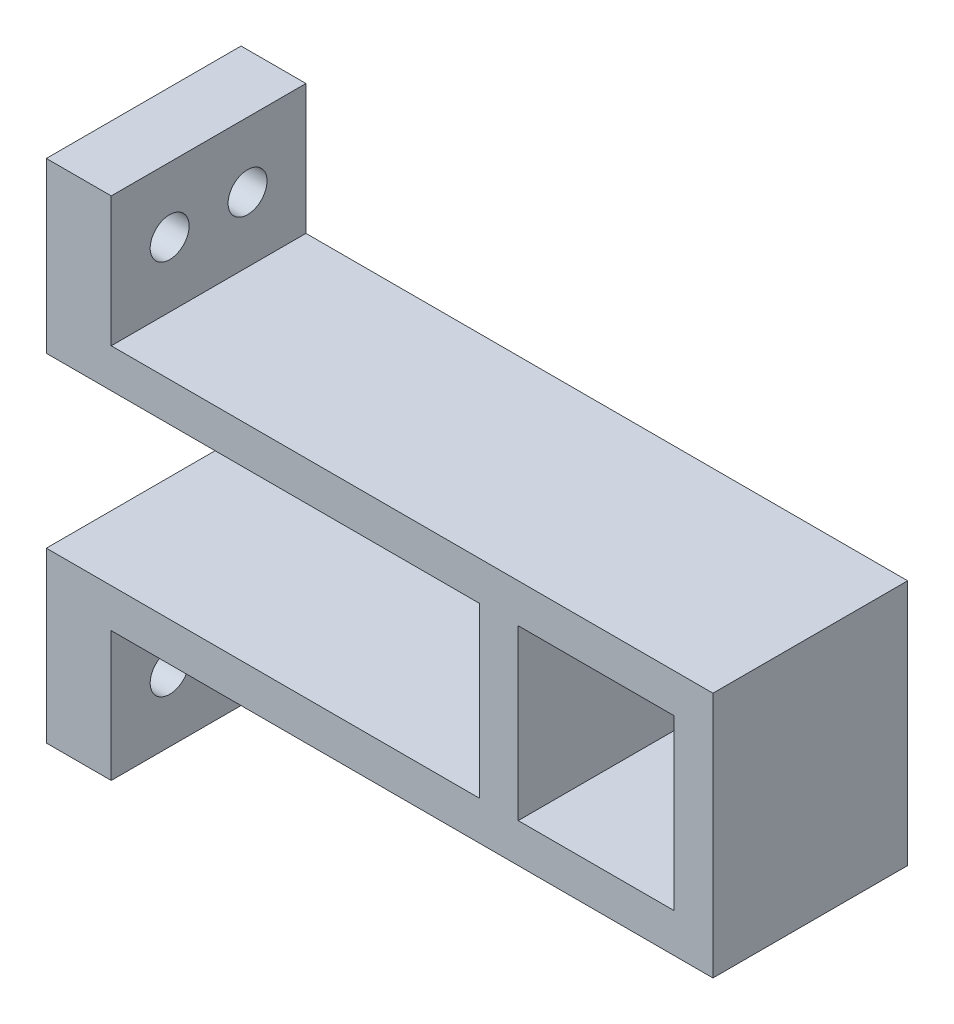
ISO-10303-21;
HEADER;
FILE_DESCRIPTION(('STEP AP214'),'2;1');
FILE_NAME('part.step','',(''),(''),'','','');
FILE_SCHEMA(('AUTOMOTIVE_DESIGN { 1 0 10303 214 1 1 1 1 }'));
ENDSEC;
DATA;
#1=APPLICATION_CONTEXT('core data for automotive mechanical design processes');
#2=APPLICATION_PROTOCOL_DEFINITION('international standard','automotive_design',2000,#1);
#3=PRODUCT_CONTEXT('',#1,'mechanical');
#4=PRODUCT('Part','Part','',(#3));
#5=PRODUCT_RELATED_PRODUCT_CATEGORY('part','',(#4));
#6=PRODUCT_DEFINITION_FORMATION('','',#4);
#7=PRODUCT_DEFINITION_CONTEXT('part definition',#1,'design');
#8=PRODUCT_DEFINITION('design','',#6,#7);
#9=PRODUCT_DEFINITION_SHAPE('','',#8);
#10=(LENGTH_UNIT() NAMED_UNIT(*) SI_UNIT(.MILLI.,.METRE.));
#11=(NAMED_UNIT(*) PLANE_ANGLE_UNIT() SI_UNIT($,.RADIAN.));
#12=(NAMED_UNIT(*) SI_UNIT($,.STERADIAN.) SOLID_ANGLE_UNIT());
#13=UNCERTAINTY_MEASURE_WITH_UNIT(LENGTH_MEASURE(1.E-05),#10,'distance_accuracy_value','');
#14=(GEOMETRIC_REPRESENTATION_CONTEXT(3) GLOBAL_UNCERTAINTY_ASSIGNED_CONTEXT((#13)) GLOBAL_UNIT_ASSIGNED_CONTEXT((#10,
#11,#12)) REPRESENTATION_CONTEXT('',''));
#15=CARTESIAN_POINT('',(0.,0.,0.));
#16=DIRECTION('',(0.,0.,1.));
#17=DIRECTION('',(1.,0.,0.));
#18=AXIS2_PLACEMENT_3D('',#15,#16,#17);
#19=CARTESIAN_POINT('',(5.,13.,0.));
#20=DIRECTION('',(0.,-1.,0.));
#21=DIRECTION('',(0.,0.,-1.));
#22=AXIS2_PLACEMENT_3D('',#19,#20,#21);
#23=PLANE('',#22);
#24=DIRECTION('',(0.,0.,1.));
#25=VECTOR('',#24,1.);
#26=CARTESIAN_POINT('',(33.35,13.,0.));
#27=LINE('',#26,#25);
#28=CARTESIAN_POINT('',(33.35,13.,-15.));
#29=VERTEX_POINT('',#28);
#30=CARTESIAN_POINT('',(33.35,13.,0.));
#31=VERTEX_POINT('',#30);
#32=EDGE_CURVE('E273',#29,#31,#27,.T.);
#33=ORIENTED_EDGE('',*,*,#32,.F.);
#34=DIRECTION('',(-1.,0.,0.));
#35=VECTOR('',#34,1.);
#36=CARTESIAN_POINT('',(5.,13.,-15.));
#37=LINE('',#36,#35);
#38=CARTESIAN_POINT('',(0.,13.,-15.));
#39=VERTEX_POINT('',#38);
#40=EDGE_CURVE('E224',#29,#39,#37,.T.);
#41=ORIENTED_EDGE('',*,*,#40,.T.);
#42=DIRECTION('',(0.,0.,1.));
#43=VECTOR('',#42,1.);
#44=CARTESIAN_POINT('',(0.,13.,0.));
#45=LINE('',#44,#43);
#46=CARTESIAN_POINT('',(0.,13.,0.));
#47=VERTEX_POINT('',#46);
#48=EDGE_CURVE('E208',#39,#47,#45,.T.);
#49=ORIENTED_EDGE('',*,*,#48,.T.);
#50=DIRECTION('',(-1.,0.,0.));
#51=VECTOR('',#50,1.);
#52=CARTESIAN_POINT('',(5.,13.,0.));
#53=LINE('',#52,#51);
#54=EDGE_CURVE('E213',#31,#47,#53,.T.);
#55=ORIENTED_EDGE('',*,*,#54,.F.);
#56=EDGE_LOOP('',(#33,#41,#49,#55));
#57=FACE_BOUND('',#56,.T.);
#58=ADVANCED_FACE('F32',(#57),#23,.F.);
#59=CARTESIAN_POINT('',(5.,26.,0.));
#60=DIRECTION('',(0.,1.,0.));
#61=DIRECTION('',(0.,0.,1.));
#62=AXIS2_PLACEMENT_3D('',#59,#60,#61);
#63=PLANE('',#62);
#64=DIRECTION('',(0.,0.,-1.));
#65=VECTOR('',#64,1.);
#66=CARTESIAN_POINT('',(33.35,26.,0.));
#67=LINE('',#66,#65);
#68=CARTESIAN_POINT('',(33.35,26.,0.));
#69=VERTEX_POINT('',#68);
#70=CARTESIAN_POINT('',(33.35,26.,-15.));
#71=VERTEX_POINT('',#70);
#72=EDGE_CURVE('E11',#69,#71,#67,.T.);
#73=ORIENTED_EDGE('',*,*,#72,.F.);
#74=DIRECTION('',(-1.,0.,0.));
#75=VECTOR('',#74,1.);
#76=CARTESIAN_POINT('',(5.,26.,0.));
#77=LINE('',#76,#75);
#78=CARTESIAN_POINT('',(0.,26.,0.));
#79=VERTEX_POINT('',#78);
#80=EDGE_CURVE('E158',#69,#79,#77,.T.);
#81=ORIENTED_EDGE('',*,*,#80,.T.);
#82=DIRECTION('',(0.,0.,-1.));
#83=VECTOR('',#82,1.);
#84=CARTESIAN_POINT('',(0.,26.,0.));
#85=LINE('',#84,#83);
#86=CARTESIAN_POINT('',(0.,26.,-15.));
#87=VERTEX_POINT('',#86);
#88=EDGE_CURVE('E302',#79,#87,#85,.T.);
#89=ORIENTED_EDGE('',*,*,#88,.T.);
#90=DIRECTION('',(-1.,0.,0.));
#91=VECTOR('',#90,1.);
#92=CARTESIAN_POINT('',(5.,26.,-15.));
#93=LINE('',#92,#91);
#94=EDGE_CURVE('E311',#71,#87,#93,.T.);
#95=ORIENTED_EDGE('',*,*,#94,.F.);
#96=EDGE_LOOP('',(#73,#81,#89,#95));
#97=FACE_BOUND('',#96,.T.);
#98=ADVANCED_FACE('F337',(#97),#63,.F.);
#99=CARTESIAN_POINT('',(48.35,0.,0.));
#100=DIRECTION('',(1.,0.,0.));
#101=DIRECTION('',(0.,0.,-1.));
#102=AXIS2_PLACEMENT_3D('',#99,#100,#101);
#103=PLANE('',#102);
#104=DIRECTION('',(0.,0.,-1.));
#105=VECTOR('',#104,1.);
#106=CARTESIAN_POINT('',(48.35,26.,0.));
#107=LINE('',#106,#105);
#108=CARTESIAN_POINT('',(48.35,26.,0.));
#109=VERTEX_POINT('',#108);
#110=CARTESIAN_POINT('',(48.35,26.,-15.));
#111=VERTEX_POINT('',#110);
#112=EDGE_CURVE('E155',#109,#111,#107,.T.);
#113=ORIENTED_EDGE('',*,*,#112,.T.);
#114=DIRECTION('',(0.,1.,0.));
#115=VECTOR('',#114,1.);
#116=CARTESIAN_POINT('',(48.35,29.,-15.));
#117=LINE('',#116,#115);
#118=CARTESIAN_POINT('',(48.35,13.,-15.));
#119=VERTEX_POINT('',#118);
#120=EDGE_CURVE('E160',#119,#111,#117,.T.);
#121=ORIENTED_EDGE('',*,*,#120,.F.);
#122=DIRECTION('',(0.,0.,1.));
#123=VECTOR('',#122,1.);
#124=CARTESIAN_POINT('',(48.35,13.,0.));
#125=LINE('',#124,#123);
#126=CARTESIAN_POINT('',(48.35,13.,0.));
#127=VERTEX_POINT('',#126);
#128=EDGE_CURVE('E183',#119,#127,#125,.T.);
#129=ORIENTED_EDGE('',*,*,#128,.T.);
#130=DIRECTION('',(0.,-1.,0.));
#131=VECTOR('',#130,1.);
#132=CARTESIAN_POINT('',(48.35,29.,0.));
#133=LINE('',#132,#131);
#134=EDGE_CURVE('E157',#109,#127,#133,.T.);
#135=ORIENTED_EDGE('',*,*,#134,.F.);
#136=EDGE_LOOP('',(#113,#121,#129,#135));
#137=FACE_BOUND('',#136,.T.);
#138=ADVANCED_FACE('F320',(#137),#103,.F.);
#139=CARTESIAN_POINT('',(5.,0.,0.));
#140=DIRECTION('',(-1.,0.,0.));
#141=DIRECTION('',(0.,0.,1.));
#142=AXIS2_PLACEMENT_3D('',#139,#140,#141);
#143=PLANE('',#142);
#144=CARTESIAN_POINT('',(5.,5.,-10.5));
#145=DIRECTION('',(1.,0.,0.));
#146=DIRECTION('',(0.,0.,-1.));
#147=AXIS2_PLACEMENT_3D('',#144,#145,#146);
#148=CIRCLE('',#147,1.5);
#149=CARTESIAN_POINT('',(5.,5.,-12.));
#150=VERTEX_POINT('',#149);
#151=EDGE_CURVE('E193',#150,#150,#148,.T.);
#152=ORIENTED_EDGE('',*,*,#151,.F.);
#153=EDGE_LOOP('',(#152));
#154=FACE_BOUND('',#153,.T.);
#155=CARTESIAN_POINT('',(5.,5.,-4.5));
#156=DIRECTION('',(1.,0.,0.));
#157=DIRECTION('',(0.,0.,-1.));
#158=AXIS2_PLACEMENT_3D('',#155,#156,#157);
#159=CIRCLE('',#158,1.5);
#160=CARTESIAN_POINT('',(5.,5.,-6.));
#161=VERTEX_POINT('',#160);
#162=EDGE_CURVE('E199',#161,#161,#159,.T.);
#163=ORIENTED_EDGE('',*,*,#162,.F.);
#164=EDGE_LOOP('',(#163));
#165=FACE_BOUND('',#164,.T.);
#166=DIRECTION('',(0.,0.,-1.));
#167=VECTOR('',#166,1.);
#168=CARTESIAN_POINT('',(5.,10.,0.));
#169=LINE('',#168,#167);
#170=CARTESIAN_POINT('',(5.,9.99999999999999,0.));
#171=VERTEX_POINT('',#170);
#172=CARTESIAN_POINT('',(5.,10.,-15.));
#173=VERTEX_POINT('',#172);
#174=EDGE_CURVE('E182',#171,#173,#169,.T.);
#175=ORIENTED_EDGE('',*,*,#174,.F.);
#176=DIRECTION('',(0.,-1.,0.));
#177=VECTOR('',#176,1.);
#178=CARTESIAN_POINT('',(5.,0.,0.));
#179=LINE('',#178,#177);
#180=CARTESIAN_POINT('',(5.,0.,0.));
#181=VERTEX_POINT('',#180);
#182=EDGE_CURVE('E205',#171,#181,#179,.T.);
#183=ORIENTED_EDGE('',*,*,#182,.T.);
#184=DIRECTION('',(0.,0.,-1.));
#185=VECTOR('',#184,1.);
#186=CARTESIAN_POINT('',(5.,0.,0.));
#187=LINE('',#186,#185);
#188=CARTESIAN_POINT('',(5.,0.,-15.));
#189=VERTEX_POINT('',#188);
#190=EDGE_CURVE('E207',#181,#189,#187,.T.);
#191=ORIENTED_EDGE('',*,*,#190,.T.);
#192=DIRECTION('',(0.,1.,0.));
#193=VECTOR('',#192,1.);
#194=CARTESIAN_POINT('',(5.,0.,-15.));
#195=LINE('',#194,#193);
#196=EDGE_CURVE('E210',#189,#173,#195,.T.);
#197=ORIENTED_EDGE('',*,*,#196,.T.);
#198=EDGE_LOOP('',(#175,#183,#191,#197));
#199=FACE_BOUND('',#198,.T.);
#200=ADVANCED_FACE('F254',(#154,#165,#199),#143,.F.);
#201=CARTESIAN_POINT('',(0.,0.,0.));
#202=DIRECTION('',(-1.,0.,0.));
#203=DIRECTION('',(0.,0.,1.));
#204=AXIS2_PLACEMENT_3D('',#201,#202,#203);
#205=PLANE('',#204);
#206=CARTESIAN_POINT('',(0.,5.,-4.5));
#207=DIRECTION('',(1.,0.,0.));
#208=DIRECTION('',(0.,0.,-1.));
#209=AXIS2_PLACEMENT_3D('',#206,#207,#208);
#210=CIRCLE('',#209,1.5);
#211=CARTESIAN_POINT('',(0.,5.,-6.));
#212=VERTEX_POINT('',#211);
#213=EDGE_CURVE('E196',#212,#212,#210,.T.);
#214=ORIENTED_EDGE('',*,*,#213,.T.);
#215=EDGE_LOOP('',(#214));
#216=FACE_BOUND('',#215,.T.);
#217=DIRECTION('',(0.,-1.,0.));
#218=VECTOR('',#217,1.);
#219=CARTESIAN_POINT('',(0.,0.,0.));
#220=LINE('',#219,#218);
#221=CARTESIAN_POINT('',(0.,0.,0.));
#222=VERTEX_POINT('',#221);
#223=EDGE_CURVE('E202',#47,#222,#220,.T.);
#224=ORIENTED_EDGE('',*,*,#223,.F.);
#225=ORIENTED_EDGE('',*,*,#48,.F.);
#226=DIRECTION('',(0.,1.,0.));
#227=VECTOR('',#226,1.);
#228=CARTESIAN_POINT('',(0.,0.,-15.));
#229=LINE('',#228,#227);
#230=CARTESIAN_POINT('',(0.,0.,-15.));
#231=VERTEX_POINT('',#230);
#232=EDGE_CURVE('E218',#231,#39,#229,.T.);
#233=ORIENTED_EDGE('',*,*,#232,.F.);
#234=DIRECTION('',(0.,0.,-1.));
#235=VECTOR('',#234,1.);
#236=CARTESIAN_POINT('',(0.,0.,0.));
#237=LINE('',#236,#235);
#238=EDGE_CURVE('E216',#222,#231,#237,.T.);
#239=ORIENTED_EDGE('',*,*,#238,.F.);
#240=EDGE_LOOP('',(#224,#225,#233,#239));
#241=FACE_BOUND('',#240,.T.);
#242=CARTESIAN_POINT('',(0.,5.,-10.5));
#243=DIRECTION('',(1.,0.,0.));
#244=DIRECTION('',(0.,0.,-1.));
#245=AXIS2_PLACEMENT_3D('',#242,#243,#244);
#246=CIRCLE('',#245,1.5);
#247=CARTESIAN_POINT('',(0.,5.,-12.));
#248=VERTEX_POINT('',#247);
#249=EDGE_CURVE('E192',#248,#248,#246,.T.);
#250=ORIENTED_EDGE('',*,*,#249,.T.);
#251=EDGE_LOOP('',(#250));
#252=FACE_BOUND('',#251,.T.);
#253=ADVANCED_FACE('F243',(#216,#241,#252),#205,.T.);
#254=CARTESIAN_POINT('',(5.,0.,0.));
#255=DIRECTION('',(0.,0.,-1.));
#256=DIRECTION('',(-1.,0.,0.));
#257=AXIS2_PLACEMENT_3D('',#254,#255,#256);
#258=PLANE('',#257);
#259=DIRECTION('',(0.,-1.,0.));
#260=VECTOR('',#259,1.);
#261=CARTESIAN_POINT('',(36.35,29.,0.));
#262=LINE('',#261,#260);
#263=CARTESIAN_POINT('',(36.35,26.,0.));
#264=VERTEX_POINT('',#263);
#265=CARTESIAN_POINT('',(36.35,13.,0.));
#266=VERTEX_POINT('',#265);
#267=EDGE_CURVE('E47',#264,#266,#262,.T.);
#268=ORIENTED_EDGE('',*,*,#267,.F.);
#269=EDGE_CURVE('E148',#109,#264,#77,.T.);
#270=ORIENTED_EDGE('',*,*,#269,.F.);
#271=ORIENTED_EDGE('',*,*,#134,.T.);
#272=EDGE_CURVE('E151',#127,#266,#53,.T.);
#273=ORIENTED_EDGE('',*,*,#272,.T.);
#274=EDGE_LOOP('',(#268,#270,#271,#273));
#275=FACE_BOUND('',#274,.T.);
#276=DIRECTION('',(-1.,0.,0.));
#277=VECTOR('',#276,1.);
#278=CARTESIAN_POINT('',(51.35,29.,0.));
#279=LINE('',#278,#277);
#280=CARTESIAN_POINT('',(51.35,29.,0.));
#281=VERTEX_POINT('',#280);
#282=CARTESIAN_POINT('',(5.,29.,0.));
#283=VERTEX_POINT('',#282);
#284=EDGE_CURVE('E175',#281,#283,#279,.T.);
#285=ORIENTED_EDGE('',*,*,#284,.T.);
#286=DIRECTION('',(0.,-1.,0.));
#287=VECTOR('',#286,1.);
#288=CARTESIAN_POINT('',(5.,26.,0.));
#289=LINE('',#288,#287);
#290=CARTESIAN_POINT('',(5.,39.,0.));
#291=VERTEX_POINT('',#290);
#292=EDGE_CURVE('E292',#291,#283,#289,.T.);
#293=ORIENTED_EDGE('',*,*,#292,.F.);
#294=DIRECTION('',(-1.,0.,0.));
#295=VECTOR('',#294,1.);
#296=CARTESIAN_POINT('',(5.,39.,0.));
#297=LINE('',#296,#295);
#298=CARTESIAN_POINT('',(0.,39.,0.));
#299=VERTEX_POINT('',#298);
#300=EDGE_CURVE('E299',#291,#299,#297,.T.);
#301=ORIENTED_EDGE('',*,*,#300,.T.);
#302=DIRECTION('',(0.,-1.,0.));
#303=VECTOR('',#302,1.);
#304=CARTESIAN_POINT('',(0.,26.,0.));
#305=LINE('',#304,#303);
#306=EDGE_CURVE('E289',#299,#79,#305,.T.);
#307=ORIENTED_EDGE('',*,*,#306,.T.);
#308=ORIENTED_EDGE('',*,*,#80,.F.);
#309=DIRECTION('',(0.,-1.,0.));
#310=VECTOR('',#309,1.);
#311=CARTESIAN_POINT('',(33.35,29.,0.));
#312=LINE('',#311,#310);
#313=EDGE_CURVE('E326',#69,#31,#312,.T.);
#314=ORIENTED_EDGE('',*,*,#313,.T.);
#315=ORIENTED_EDGE('',*,*,#54,.T.);
#316=ORIENTED_EDGE('',*,*,#223,.T.);
#317=DIRECTION('',(-1.,0.,0.));
#318=VECTOR('',#317,1.);
#319=CARTESIAN_POINT('',(5.,0.,0.));
#320=LINE('',#319,#318);
#321=EDGE_CURVE('E144',#181,#222,#320,.T.);
#322=ORIENTED_EDGE('',*,*,#321,.F.);
#323=ORIENTED_EDGE('',*,*,#182,.F.);
#324=DIRECTION('',(-1.,0.,0.));
#325=VECTOR('',#324,1.);
#326=CARTESIAN_POINT('',(48.35,10.,0.));
#327=LINE('',#326,#325);
#328=CARTESIAN_POINT('',(51.35,10.,0.));
#329=VERTEX_POINT('',#328);
#330=EDGE_CURVE('E190',#329,#171,#327,.T.);
#331=ORIENTED_EDGE('',*,*,#330,.F.);
#332=DIRECTION('',(0.,-1.,0.));
#333=VECTOR('',#332,1.);
#334=CARTESIAN_POINT('',(51.35,29.,0.));
#335=LINE('',#334,#333);
#336=EDGE_CURVE('E166',#281,#329,#335,.T.);
#337=ORIENTED_EDGE('',*,*,#336,.F.);
#338=EDGE_LOOP('',(#285,#293,#301,#307,#308,#314,#315,#316,#322,#323,#331,#337));
#339=FACE_BOUND('',#338,.T.);
#340=ADVANCED_FACE('F34',(#275,#339),#258,.F.);
#341=CARTESIAN_POINT('',(5.,0.,0.));
#342=DIRECTION('',(0.,1.,0.));
#343=DIRECTION('',(0.,0.,1.));
#344=AXIS2_PLACEMENT_3D('',#341,#342,#343);
#345=PLANE('',#344);
#346=ORIENTED_EDGE('',*,*,#238,.T.);
#347=DIRECTION('',(-1.,0.,0.));
#348=VECTOR('',#347,1.);
#349=CARTESIAN_POINT('',(5.,0.,-15.));
#350=LINE('',#349,#348);
#351=EDGE_CURVE('E228',#189,#231,#350,.T.);
#352=ORIENTED_EDGE('',*,*,#351,.F.);
#353=ORIENTED_EDGE('',*,*,#190,.F.);
#354=ORIENTED_EDGE('',*,*,#321,.T.);
#355=EDGE_LOOP('',(#346,#352,#353,#354));
#356=FACE_BOUND('',#355,.T.);
#357=ADVANCED_FACE('F235',(#356),#345,.F.);
#358=CARTESIAN_POINT('',(5.,0.,-15.));
#359=DIRECTION('',(0.,0.,1.));
#360=DIRECTION('',(1.,0.,0.));
#361=AXIS2_PLACEMENT_3D('',#358,#359,#360);
#362=PLANE('',#361);
#363=DIRECTION('',(0.,1.,0.));
#364=VECTOR('',#363,1.);
#365=CARTESIAN_POINT('',(36.35,29.,-15.));
#366=LINE('',#365,#364);
#367=CARTESIAN_POINT('',(36.35,13.,-15.));
#368=VERTEX_POINT('',#367);
#369=CARTESIAN_POINT('',(36.35,26.,-15.));
#370=VERTEX_POINT('',#369);
#371=EDGE_CURVE('E52',#368,#370,#366,.T.);
#372=ORIENTED_EDGE('',*,*,#371,.F.);
#373=EDGE_CURVE('E225',#119,#368,#37,.T.);
#374=ORIENTED_EDGE('',*,*,#373,.F.);
#375=ORIENTED_EDGE('',*,*,#120,.T.);
#376=EDGE_CURVE('E162',#111,#370,#93,.T.);
#377=ORIENTED_EDGE('',*,*,#376,.T.);
#378=EDGE_LOOP('',(#372,#374,#375,#377));
#379=FACE_BOUND('',#378,.T.);
#380=DIRECTION('',(-1.,0.,0.));
#381=VECTOR('',#380,1.);
#382=CARTESIAN_POINT('',(48.35,10.,-15.));
#383=LINE('',#382,#381);
#384=CARTESIAN_POINT('',(51.35,10.,-15.));
#385=VERTEX_POINT('',#384);
#386=EDGE_CURVE('E186',#385,#173,#383,.T.);
#387=ORIENTED_EDGE('',*,*,#386,.T.);
#388=ORIENTED_EDGE('',*,*,#196,.F.);
#389=ORIENTED_EDGE('',*,*,#351,.T.);
#390=ORIENTED_EDGE('',*,*,#232,.T.);
#391=ORIENTED_EDGE('',*,*,#40,.F.);
#392=DIRECTION('',(0.,1.,0.));
#393=VECTOR('',#392,1.);
#394=CARTESIAN_POINT('',(33.35,29.,-15.));
#395=LINE('',#394,#393);
#396=EDGE_CURVE('E324',#29,#71,#395,.T.);
#397=ORIENTED_EDGE('',*,*,#396,.T.);
#398=ORIENTED_EDGE('',*,*,#94,.T.);
#399=DIRECTION('',(0.,1.,0.));
#400=VECTOR('',#399,1.);
#401=CARTESIAN_POINT('',(0.,26.,-15.));
#402=LINE('',#401,#400);
#403=CARTESIAN_POINT('',(0.,39.,-15.));
#404=VERTEX_POINT('',#403);
#405=EDGE_CURVE('E305',#87,#404,#402,.T.);
#406=ORIENTED_EDGE('',*,*,#405,.T.);
#407=DIRECTION('',(-1.,0.,0.));
#408=VECTOR('',#407,1.);
#409=CARTESIAN_POINT('',(5.,39.,-15.));
#410=LINE('',#409,#408);
#411=CARTESIAN_POINT('',(5.,39.,-15.));
#412=VERTEX_POINT('',#411);
#413=EDGE_CURVE('E309',#412,#404,#410,.T.);
#414=ORIENTED_EDGE('',*,*,#413,.F.);
#415=DIRECTION('',(0.,1.,0.));
#416=VECTOR('',#415,1.);
#417=CARTESIAN_POINT('',(5.,26.,-15.));
#418=LINE('',#417,#416);
#419=CARTESIAN_POINT('',(5.,29.,-15.));
#420=VERTEX_POINT('',#419);
#421=EDGE_CURVE('E294',#420,#412,#418,.T.);
#422=ORIENTED_EDGE('',*,*,#421,.F.);
#423=DIRECTION('',(-1.,0.,0.));
#424=VECTOR('',#423,1.);
#425=CARTESIAN_POINT('',(51.35,29.,-15.));
#426=LINE('',#425,#424);
#427=CARTESIAN_POINT('',(51.35,29.,-15.));
#428=VERTEX_POINT('',#427);
#429=EDGE_CURVE('E180',#428,#420,#426,.T.);
#430=ORIENTED_EDGE('',*,*,#429,.F.);
#431=DIRECTION('',(0.,1.,0.));
#432=VECTOR('',#431,1.);
#433=CARTESIAN_POINT('',(51.35,29.,-15.));
#434=LINE('',#433,#432);
#435=EDGE_CURVE('E172',#385,#428,#434,.T.);
#436=ORIENTED_EDGE('',*,*,#435,.F.);
#437=EDGE_LOOP('',(#387,#388,#389,#390,#391,#397,#398,#406,#414,#422,#430,#436));
#438=FACE_BOUND('',#437,.T.);
#439=ADVANCED_FACE('F248',(#379,#438),#362,.F.);
#440=ORIENTED_EDGE('',*,*,#373,.T.);
#441=DIRECTION('',(0.,0.,1.));
#442=VECTOR('',#441,1.);
#443=CARTESIAN_POINT('',(36.35,13.,0.));
#444=LINE('',#443,#442);
#445=EDGE_CURVE('E277',#368,#266,#444,.T.);
#446=ORIENTED_EDGE('',*,*,#445,.T.);
#447=ORIENTED_EDGE('',*,*,#272,.F.);
#448=ORIENTED_EDGE('',*,*,#128,.F.);
#449=EDGE_LOOP('',(#440,#446,#447,#448));
#450=FACE_BOUND('',#449,.T.);
#451=ADVANCED_FACE('F323',(#450),#23,.F.);
#452=CARTESIAN_POINT('',(5.,5.,-4.5));
#453=DIRECTION('',(-1.,0.,0.));
#454=DIRECTION('',(0.,0.,1.));
#455=AXIS2_PLACEMENT_3D('',#452,#453,#454);
#456=CYLINDRICAL_SURFACE('',#455,1.5);
#457=ORIENTED_EDGE('',*,*,#162,.T.);
#458=EDGE_LOOP('',(#457));
#459=FACE_BOUND('',#458,.T.);
#460=ORIENTED_EDGE('',*,*,#213,.F.);
#461=EDGE_LOOP('',(#460));
#462=FACE_BOUND('',#461,.T.);
#463=ADVANCED_FACE('F369',(#459,#462),#456,.F.);
#464=CARTESIAN_POINT('',(5.,5.,-10.5));
#465=DIRECTION('',(-1.,0.,0.));
#466=DIRECTION('',(0.,0.,1.));
#467=AXIS2_PLACEMENT_3D('',#464,#465,#466);
#468=CYLINDRICAL_SURFACE('',#467,1.5);
#469=ORIENTED_EDGE('',*,*,#151,.T.);
#470=EDGE_LOOP('',(#469));
#471=FACE_BOUND('',#470,.T.);
#472=ORIENTED_EDGE('',*,*,#249,.F.);
#473=EDGE_LOOP('',(#472));
#474=FACE_BOUND('',#473,.T.);
#475=ADVANCED_FACE('F374',(#471,#474),#468,.F.);
#476=CARTESIAN_POINT('',(48.35,10.,0.));
#477=DIRECTION('',(0.,1.,0.));
#478=DIRECTION('',(0.,0.,1.));
#479=AXIS2_PLACEMENT_3D('',#476,#477,#478);
#480=PLANE('',#479);
#481=ORIENTED_EDGE('',*,*,#330,.T.);
#482=ORIENTED_EDGE('',*,*,#174,.T.);
#483=ORIENTED_EDGE('',*,*,#386,.F.);
#484=DIRECTION('',(0.,0.,-1.));
#485=VECTOR('',#484,1.);
#486=CARTESIAN_POINT('',(51.35,10.,0.));
#487=LINE('',#486,#485);
#488=EDGE_CURVE('E169',#329,#385,#487,.T.);
#489=ORIENTED_EDGE('',*,*,#488,.F.);
#490=EDGE_LOOP('',(#481,#482,#483,#489));
#491=FACE_BOUND('',#490,.T.);
#492=ADVANCED_FACE('F256',(#491),#480,.F.);
#493=CARTESIAN_POINT('',(51.35,29.,0.));
#494=DIRECTION('',(0.,-1.,0.));
#495=DIRECTION('',(0.,0.,-1.));
#496=AXIS2_PLACEMENT_3D('',#493,#494,#495);
#497=PLANE('',#496);
#498=ORIENTED_EDGE('',*,*,#429,.T.);
#499=DIRECTION('',(0.,0.,1.));
#500=VECTOR('',#499,1.);
#501=CARTESIAN_POINT('',(5.,29.,0.));
#502=LINE('',#501,#500);
#503=EDGE_CURVE('E270',#420,#283,#502,.T.);
#504=ORIENTED_EDGE('',*,*,#503,.T.);
#505=ORIENTED_EDGE('',*,*,#284,.F.);
#506=DIRECTION('',(0.,0.,1.));
#507=VECTOR('',#506,1.);
#508=CARTESIAN_POINT('',(51.35,29.,0.));
#509=LINE('',#508,#507);
#510=EDGE_CURVE('E174',#428,#281,#509,.T.);
#511=ORIENTED_EDGE('',*,*,#510,.F.);
#512=EDGE_LOOP('',(#498,#504,#505,#511));
#513=FACE_BOUND('',#512,.T.);
#514=ADVANCED_FACE('F268',(#513),#497,.F.);
#515=CARTESIAN_POINT('',(51.35,0.,0.));
#516=DIRECTION('',(1.,0.,0.));
#517=DIRECTION('',(0.,0.,-1.));
#518=AXIS2_PLACEMENT_3D('',#515,#516,#517);
#519=PLANE('',#518);
#520=ORIENTED_EDGE('',*,*,#336,.T.);
#521=ORIENTED_EDGE('',*,*,#488,.T.);
#522=ORIENTED_EDGE('',*,*,#435,.T.);
#523=ORIENTED_EDGE('',*,*,#510,.T.);
#524=EDGE_LOOP('',(#520,#521,#522,#523));
#525=FACE_BOUND('',#524,.T.);
#526=ADVANCED_FACE('F263',(#525),#519,.T.);
#527=CARTESIAN_POINT('',(5.,0.,0.));
#528=DIRECTION('',(-1.,0.,0.));
#529=DIRECTION('',(0.,0.,1.));
#530=AXIS2_PLACEMENT_3D('',#527,#528,#529);
#531=PLANE('',#530);
#532=CARTESIAN_POINT('',(5.,34.,-10.5));
#533=DIRECTION('',(1.,0.,0.));
#534=DIRECTION('',(0.,0.,-1.));
#535=AXIS2_PLACEMENT_3D('',#532,#533,#534);
#536=CIRCLE('',#535,1.5);
#537=CARTESIAN_POINT('',(5.,34.,-12.));
#538=VERTEX_POINT('',#537);
#539=EDGE_CURVE('E280',#538,#538,#536,.T.);
#540=ORIENTED_EDGE('',*,*,#539,.F.);
#541=EDGE_LOOP('',(#540));
#542=FACE_BOUND('',#541,.T.);
#543=CARTESIAN_POINT('',(5.,34.,-4.5));
#544=DIRECTION('',(1.,0.,0.));
#545=DIRECTION('',(0.,0.,-1.));
#546=AXIS2_PLACEMENT_3D('',#543,#544,#545);
#547=CIRCLE('',#546,1.5);
#548=CARTESIAN_POINT('',(5.,34.,-6.));
#549=VERTEX_POINT('',#548);
#550=EDGE_CURVE('E286',#549,#549,#547,.T.);
#551=ORIENTED_EDGE('',*,*,#550,.F.);
#552=EDGE_LOOP('',(#551));
#553=FACE_BOUND('',#552,.T.);
#554=ORIENTED_EDGE('',*,*,#503,.F.);
#555=ORIENTED_EDGE('',*,*,#421,.T.);
#556=DIRECTION('',(0.,0.,1.));
#557=VECTOR('',#556,1.);
#558=CARTESIAN_POINT('',(5.,39.,0.));
#559=LINE('',#558,#557);
#560=EDGE_CURVE('E297',#412,#291,#559,.T.);
#561=ORIENTED_EDGE('',*,*,#560,.T.);
#562=ORIENTED_EDGE('',*,*,#292,.T.);
#563=EDGE_LOOP('',(#554,#555,#561,#562));
#564=FACE_BOUND('',#563,.T.);
#565=ADVANCED_FACE('F346',(#542,#553,#564),#531,.F.);
#566=CARTESIAN_POINT('',(0.,0.,0.));
#567=DIRECTION('',(-1.,0.,0.));
#568=DIRECTION('',(0.,0.,1.));
#569=AXIS2_PLACEMENT_3D('',#566,#567,#568);
#570=PLANE('',#569);
#571=CARTESIAN_POINT('',(0.,34.,-4.5));
#572=DIRECTION('',(1.,0.,0.));
#573=DIRECTION('',(0.,0.,-1.));
#574=AXIS2_PLACEMENT_3D('',#571,#572,#573);
#575=CIRCLE('',#574,1.5);
#576=CARTESIAN_POINT('',(0.,34.,-6.));
#577=VERTEX_POINT('',#576);
#578=EDGE_CURVE('E283',#577,#577,#575,.T.);
#579=ORIENTED_EDGE('',*,*,#578,.T.);
#580=EDGE_LOOP('',(#579));
#581=FACE_BOUND('',#580,.T.);
#582=ORIENTED_EDGE('',*,*,#306,.F.);
#583=DIRECTION('',(0.,0.,1.));
#584=VECTOR('',#583,1.);
#585=CARTESIAN_POINT('',(0.,39.,0.));
#586=LINE('',#585,#584);
#587=EDGE_CURVE('E295',#404,#299,#586,.T.);
#588=ORIENTED_EDGE('',*,*,#587,.F.);
#589=ORIENTED_EDGE('',*,*,#405,.F.);
#590=ORIENTED_EDGE('',*,*,#88,.F.);
#591=EDGE_LOOP('',(#582,#588,#589,#590));
#592=FACE_BOUND('',#591,.T.);
#593=CARTESIAN_POINT('',(0.,34.,-10.5));
#594=DIRECTION('',(1.,0.,0.));
#595=DIRECTION('',(0.,0.,-1.));
#596=AXIS2_PLACEMENT_3D('',#593,#594,#595);
#597=CIRCLE('',#596,1.5);
#598=CARTESIAN_POINT('',(0.,34.,-12.));
#599=VERTEX_POINT('',#598);
#600=EDGE_CURVE('E275',#599,#599,#597,.T.);
#601=ORIENTED_EDGE('',*,*,#600,.T.);
#602=EDGE_LOOP('',(#601));
#603=FACE_BOUND('',#602,.T.);
#604=ADVANCED_FACE('F342',(#581,#592,#603),#570,.T.);
#605=ORIENTED_EDGE('',*,*,#269,.T.);
#606=DIRECTION('',(0.,0.,-1.));
#607=VECTOR('',#606,1.);
#608=CARTESIAN_POINT('',(36.35,26.,0.));
#609=LINE('',#608,#607);
#610=EDGE_CURVE('E40',#264,#370,#609,.T.);
#611=ORIENTED_EDGE('',*,*,#610,.T.);
#612=ORIENTED_EDGE('',*,*,#376,.F.);
#613=ORIENTED_EDGE('',*,*,#112,.F.);
#614=EDGE_LOOP('',(#605,#611,#612,#613));
#615=FACE_BOUND('',#614,.T.);
#616=ADVANCED_FACE('F153',(#615),#63,.F.);
#617=CARTESIAN_POINT('',(5.,39.,0.));
#618=DIRECTION('',(0.,-1.,0.));
#619=DIRECTION('',(0.,0.,-1.));
#620=AXIS2_PLACEMENT_3D('',#617,#618,#619);
#621=PLANE('',#620);
#622=ORIENTED_EDGE('',*,*,#587,.T.);
#623=ORIENTED_EDGE('',*,*,#300,.F.);
#624=ORIENTED_EDGE('',*,*,#560,.F.);
#625=ORIENTED_EDGE('',*,*,#413,.T.);
#626=EDGE_LOOP('',(#622,#623,#624,#625));
#627=FACE_BOUND('',#626,.T.);
#628=ADVANCED_FACE('F345',(#627),#621,.F.);
#629=CARTESIAN_POINT('',(5.,34.,-4.5));
#630=DIRECTION('',(-1.,0.,0.));
#631=DIRECTION('',(0.,0.,1.));
#632=AXIS2_PLACEMENT_3D('',#629,#630,#631);
#633=CYLINDRICAL_SURFACE('',#632,1.5);
#634=ORIENTED_EDGE('',*,*,#550,.T.);
#635=EDGE_LOOP('',(#634));
#636=FACE_BOUND('',#635,.T.);
#637=ORIENTED_EDGE('',*,*,#578,.F.);
#638=EDGE_LOOP('',(#637));
#639=FACE_BOUND('',#638,.T.);
#640=ADVANCED_FACE('F404',(#636,#639),#633,.F.);
#641=CARTESIAN_POINT('',(5.,34.,-10.5));
#642=DIRECTION('',(-1.,0.,0.));
#643=DIRECTION('',(0.,0.,1.));
#644=AXIS2_PLACEMENT_3D('',#641,#642,#643);
#645=CYLINDRICAL_SURFACE('',#644,1.5);
#646=ORIENTED_EDGE('',*,*,#539,.T.);
#647=EDGE_LOOP('',(#646));
#648=FACE_BOUND('',#647,.T.);
#649=ORIENTED_EDGE('',*,*,#600,.F.);
#650=EDGE_LOOP('',(#649));
#651=FACE_BOUND('',#650,.T.);
#652=ADVANCED_FACE('F408',(#648,#651),#645,.F.);
#653=CARTESIAN_POINT('',(33.35,0.,0.));
#654=DIRECTION('',(1.,0.,0.));
#655=DIRECTION('',(0.,0.,-1.));
#656=AXIS2_PLACEMENT_3D('',#653,#654,#655);
#657=PLANE('',#656);
#658=ORIENTED_EDGE('',*,*,#396,.F.);
#659=ORIENTED_EDGE('',*,*,#32,.T.);
#660=ORIENTED_EDGE('',*,*,#313,.F.);
#661=ORIENTED_EDGE('',*,*,#72,.T.);
#662=EDGE_LOOP('',(#658,#659,#660,#661));
#663=FACE_BOUND('',#662,.T.);
#664=ADVANCED_FACE('F335',(#663),#657,.F.);
#665=CARTESIAN_POINT('',(36.35,0.,0.));
#666=DIRECTION('',(1.,0.,0.));
#667=DIRECTION('',(0.,0.,-1.));
#668=AXIS2_PLACEMENT_3D('',#665,#666,#667);
#669=PLANE('',#668);
#670=ORIENTED_EDGE('',*,*,#445,.F.);
#671=ORIENTED_EDGE('',*,*,#371,.T.);
#672=ORIENTED_EDGE('',*,*,#610,.F.);
#673=ORIENTED_EDGE('',*,*,#267,.T.);
#674=EDGE_LOOP('',(#670,#671,#672,#673));
#675=FACE_BOUND('',#674,.T.);
#676=ADVANCED_FACE('F140',(#675),#669,.T.);
#677=CLOSED_SHELL('',(#58,#98,#138,#200,#253,#340,#357,#439,#451,#463,#475,#492,#514,#526,#565,
#604,#616,#628,#640,#652,#664,#676));
#678=MANIFOLD_SOLID_BREP('B2',#677);
#679=ADVANCED_BREP_SHAPE_REPRESENTATION('',(#18,#678),#14);
#680=SHAPE_DEFINITION_REPRESENTATION(#9,#679);
ENDSEC;
END-ISO-10303-21;
